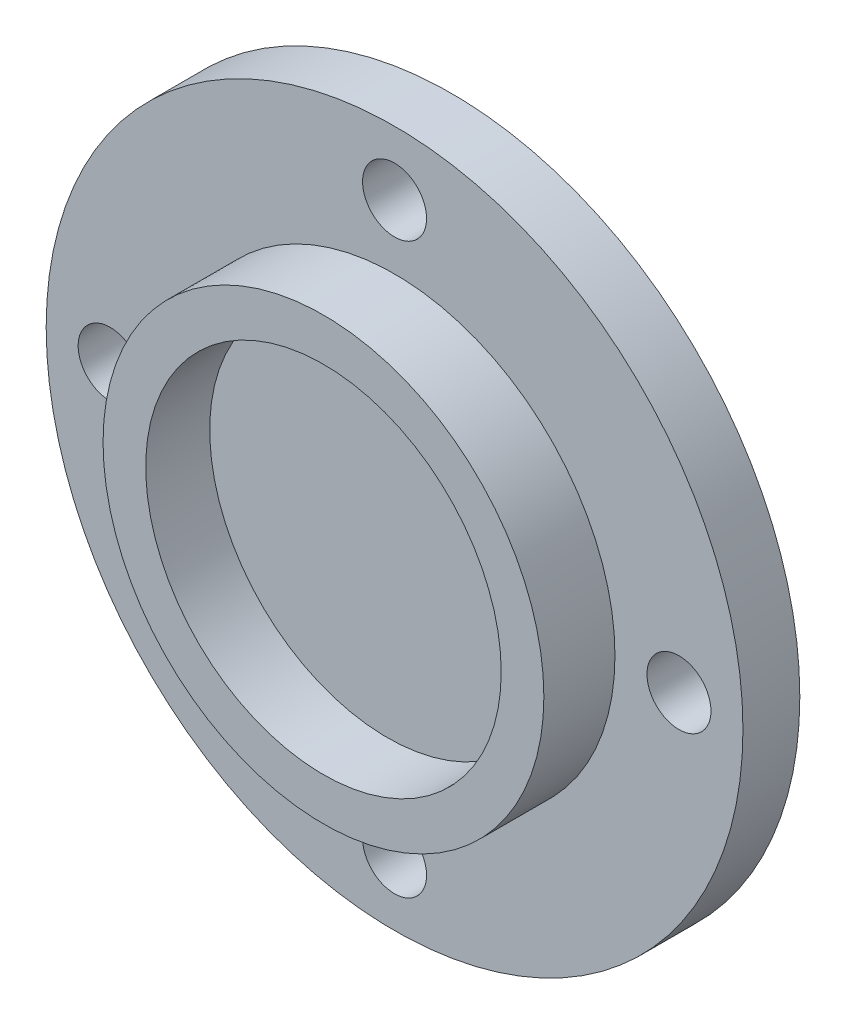
ISO-10303-21;
HEADER;
FILE_DESCRIPTION(('STEP AP214'),'2;1');
FILE_NAME('part.step','',(''),(''),'','','');
FILE_SCHEMA(('AUTOMOTIVE_DESIGN { 1 0 10303 214 1 1 1 1 }'));
ENDSEC;
DATA;
#1=APPLICATION_CONTEXT('core data for automotive mechanical design processes');
#2=APPLICATION_PROTOCOL_DEFINITION('international standard','automotive_design',2000,#1);
#3=PRODUCT_CONTEXT('',#1,'mechanical');
#4=PRODUCT('Part','Part','',(#3));
#5=PRODUCT_RELATED_PRODUCT_CATEGORY('part','',(#4));
#6=PRODUCT_DEFINITION_FORMATION('','',#4);
#7=PRODUCT_DEFINITION_CONTEXT('part definition',#1,'design');
#8=PRODUCT_DEFINITION('design','',#6,#7);
#9=PRODUCT_DEFINITION_SHAPE('','',#8);
#10=(LENGTH_UNIT() NAMED_UNIT(*) SI_UNIT(.MILLI.,.METRE.));
#11=(NAMED_UNIT(*) PLANE_ANGLE_UNIT() SI_UNIT($,.RADIAN.));
#12=(NAMED_UNIT(*) SI_UNIT($,.STERADIAN.) SOLID_ANGLE_UNIT());
#13=UNCERTAINTY_MEASURE_WITH_UNIT(LENGTH_MEASURE(1.E-05),#10,'distance_accuracy_value','');
#14=(GEOMETRIC_REPRESENTATION_CONTEXT(3) GLOBAL_UNCERTAINTY_ASSIGNED_CONTEXT((#13)) GLOBAL_UNIT_ASSIGNED_CONTEXT((#10,
#11,#12)) REPRESENTATION_CONTEXT('',''));
#15=CARTESIAN_POINT('',(0.,0.,0.));
#16=DIRECTION('',(0.,0.,1.));
#17=DIRECTION('',(1.,0.,0.));
#18=AXIS2_PLACEMENT_3D('',#15,#16,#17);
#19=CARTESIAN_POINT('',(0.,0.,8.));
#20=DIRECTION('',(0.,0.,1.));
#21=DIRECTION('',(1.,0.,0.));
#22=AXIS2_PLACEMENT_3D('',#19,#20,#21);
#23=PLANE('',#22);
#24=CARTESIAN_POINT('',(-40.,0.,8.));
#25=DIRECTION('',(0.,0.,1.));
#26=DIRECTION('',(1.,0.,0.));
#27=AXIS2_PLACEMENT_3D('',#24,#25,#26);
#28=CIRCLE('',#27,4.5);
#29=CARTESIAN_POINT('',(-35.5,0.,8.));
#30=VERTEX_POINT('',#29);
#31=EDGE_CURVE('E71',#30,#30,#28,.T.);
#32=ORIENTED_EDGE('',*,*,#31,.F.);
#33=EDGE_LOOP('',(#32));
#34=FACE_BOUND('',#33,.T.);
#35=CARTESIAN_POINT('',(0.,-40.,8.));
#36=DIRECTION('',(0.,0.,1.));
#37=DIRECTION('',(1.,0.,0.));
#38=AXIS2_PLACEMENT_3D('',#35,#36,#37);
#39=CIRCLE('',#38,4.5);
#40=CARTESIAN_POINT('',(4.5,-40.,8.));
#41=VERTEX_POINT('',#40);
#42=EDGE_CURVE('E61',#41,#41,#39,.T.);
#43=ORIENTED_EDGE('',*,*,#42,.F.);
#44=EDGE_LOOP('',(#43));
#45=FACE_BOUND('',#44,.T.);
#46=CARTESIAN_POINT('',(40.,0.,8.));
#47=DIRECTION('',(0.,0.,1.));
#48=DIRECTION('',(1.,0.,0.));
#49=AXIS2_PLACEMENT_3D('',#46,#47,#48);
#50=CIRCLE('',#49,4.5);
#51=CARTESIAN_POINT('',(44.5,0.,8.));
#52=VERTEX_POINT('',#51);
#53=EDGE_CURVE('E58',#52,#52,#50,.T.);
#54=ORIENTED_EDGE('',*,*,#53,.F.);
#55=EDGE_LOOP('',(#54));
#56=FACE_BOUND('',#55,.T.);
#57=CARTESIAN_POINT('',(0.,40.,8.));
#58=DIRECTION('',(0.,0.,1.));
#59=DIRECTION('',(1.,0.,0.));
#60=AXIS2_PLACEMENT_3D('',#57,#58,#59);
#61=CIRCLE('',#60,4.5);
#62=CARTESIAN_POINT('',(4.5,40.,8.));
#63=VERTEX_POINT('',#62);
#64=EDGE_CURVE('E55',#63,#63,#61,.T.);
#65=ORIENTED_EDGE('',*,*,#64,.F.);
#66=EDGE_LOOP('',(#65));
#67=FACE_BOUND('',#66,.T.);
#68=CARTESIAN_POINT('',(0.,0.,8.));
#69=DIRECTION('',(0.,0.,1.));
#70=DIRECTION('',(1.,0.,0.));
#71=AXIS2_PLACEMENT_3D('',#68,#69,#70);
#72=CIRCLE('',#71,49.);
#73=CARTESIAN_POINT('',(49.,0.,8.));
#74=VERTEX_POINT('',#73);
#75=EDGE_CURVE('E10',#74,#74,#72,.T.);
#76=ORIENTED_EDGE('',*,*,#75,.T.);
#77=EDGE_LOOP('',(#76));
#78=FACE_BOUND('',#77,.T.);
#79=CARTESIAN_POINT('',(0.,0.,8.));
#80=DIRECTION('',(0.,0.,1.));
#81=DIRECTION('',(1.,0.,0.));
#82=AXIS2_PLACEMENT_3D('',#79,#80,#81);
#83=CIRCLE('',#82,31.);
#84=CARTESIAN_POINT('',(31.,0.,8.));
#85=VERTEX_POINT('',#84);
#86=EDGE_CURVE('E48',#85,#85,#83,.T.);
#87=ORIENTED_EDGE('',*,*,#86,.F.);
#88=EDGE_LOOP('',(#87));
#89=FACE_BOUND('',#88,.T.);
#90=ADVANCED_FACE('F32',(#34,#45,#56,#67,#78,#89),#23,.T.);
#91=CARTESIAN_POINT('',(0.,0.,8.));
#92=DIRECTION('',(0.,0.,-1.));
#93=DIRECTION('',(-1.,0.,0.));
#94=AXIS2_PLACEMENT_3D('',#91,#92,#93);
#95=CYLINDRICAL_SURFACE('',#94,49.);
#96=ORIENTED_EDGE('',*,*,#75,.F.);
#97=EDGE_LOOP('',(#96));
#98=FACE_BOUND('',#97,.T.);
#99=CARTESIAN_POINT('',(0.,0.,0.));
#100=DIRECTION('',(0.,0.,1.));
#101=DIRECTION('',(1.,0.,0.));
#102=AXIS2_PLACEMENT_3D('',#99,#100,#101);
#103=CIRCLE('',#102,49.);
#104=CARTESIAN_POINT('',(49.,0.,0.));
#105=VERTEX_POINT('',#104);
#106=EDGE_CURVE('E40',#105,#105,#103,.T.);
#107=ORIENTED_EDGE('',*,*,#106,.T.);
#108=EDGE_LOOP('',(#107));
#109=FACE_BOUND('',#108,.T.);
#110=ADVANCED_FACE('F34',(#98,#109),#95,.T.);
#111=CARTESIAN_POINT('',(0.,0.,0.));
#112=DIRECTION('',(0.,0.,1.));
#113=DIRECTION('',(1.,0.,0.));
#114=AXIS2_PLACEMENT_3D('',#111,#112,#113);
#115=PLANE('',#114);
#116=CARTESIAN_POINT('',(-40.,0.,0.));
#117=DIRECTION('',(0.,0.,1.));
#118=DIRECTION('',(1.,0.,0.));
#119=AXIS2_PLACEMENT_3D('',#116,#117,#118);
#120=CIRCLE('',#119,4.5);
#121=CARTESIAN_POINT('',(-35.5,0.,0.));
#122=VERTEX_POINT('',#121);
#123=EDGE_CURVE('E36',#122,#122,#120,.T.);
#124=ORIENTED_EDGE('',*,*,#123,.T.);
#125=EDGE_LOOP('',(#124));
#126=FACE_BOUND('',#125,.T.);
#127=CARTESIAN_POINT('',(0.,-40.,0.));
#128=DIRECTION('',(0.,0.,1.));
#129=DIRECTION('',(1.,0.,0.));
#130=AXIS2_PLACEMENT_3D('',#127,#128,#129);
#131=CIRCLE('',#130,4.5);
#132=CARTESIAN_POINT('',(4.5,-40.,0.));
#133=VERTEX_POINT('',#132);
#134=EDGE_CURVE('E59',#133,#133,#131,.T.);
#135=ORIENTED_EDGE('',*,*,#134,.T.);
#136=EDGE_LOOP('',(#135));
#137=FACE_BOUND('',#136,.T.);
#138=CARTESIAN_POINT('',(40.,0.,0.));
#139=DIRECTION('',(0.,0.,1.));
#140=DIRECTION('',(1.,0.,0.));
#141=AXIS2_PLACEMENT_3D('',#138,#139,#140);
#142=CIRCLE('',#141,4.5);
#143=CARTESIAN_POINT('',(44.5,0.,0.));
#144=VERTEX_POINT('',#143);
#145=EDGE_CURVE('E56',#144,#144,#142,.T.);
#146=ORIENTED_EDGE('',*,*,#145,.T.);
#147=EDGE_LOOP('',(#146));
#148=FACE_BOUND('',#147,.T.);
#149=CARTESIAN_POINT('',(0.,40.,0.));
#150=DIRECTION('',(0.,0.,1.));
#151=DIRECTION('',(1.,0.,0.));
#152=AXIS2_PLACEMENT_3D('',#149,#150,#151);
#153=CIRCLE('',#152,4.5);
#154=CARTESIAN_POINT('',(4.5,40.,0.));
#155=VERTEX_POINT('',#154);
#156=EDGE_CURVE('E51',#155,#155,#153,.T.);
#157=ORIENTED_EDGE('',*,*,#156,.T.);
#158=EDGE_LOOP('',(#157));
#159=FACE_BOUND('',#158,.T.);
#160=ORIENTED_EDGE('',*,*,#106,.F.);
#161=EDGE_LOOP('',(#160));
#162=FACE_BOUND('',#161,.T.);
#163=ADVANCED_FACE('F94',(#126,#137,#148,#159,#162),#115,.F.);
#164=CARTESIAN_POINT('',(0.,0.,18.));
#165=DIRECTION('',(0.,0.,-1.));
#166=DIRECTION('',(-1.,0.,0.));
#167=AXIS2_PLACEMENT_3D('',#164,#165,#166);
#168=CYLINDRICAL_SURFACE('',#167,31.);
#169=CARTESIAN_POINT('',(0.,0.,18.));
#170=DIRECTION('',(0.,0.,1.));
#171=DIRECTION('',(1.,0.,0.));
#172=AXIS2_PLACEMENT_3D('',#169,#170,#171);
#173=CIRCLE('',#172,31.);
#174=CARTESIAN_POINT('',(31.,0.,18.));
#175=VERTEX_POINT('',#174);
#176=EDGE_CURVE('E45',#175,#175,#173,.T.);
#177=ORIENTED_EDGE('',*,*,#176,.F.);
#178=EDGE_LOOP('',(#177));
#179=FACE_BOUND('',#178,.T.);
#180=ORIENTED_EDGE('',*,*,#86,.T.);
#181=EDGE_LOOP('',(#180));
#182=FACE_BOUND('',#181,.T.);
#183=ADVANCED_FACE('F86',(#179,#182),#168,.T.);
#184=CARTESIAN_POINT('',(0.,0.,18.));
#185=DIRECTION('',(0.,0.,1.));
#186=DIRECTION('',(1.,0.,0.));
#187=AXIS2_PLACEMENT_3D('',#184,#185,#186);
#188=PLANE('',#187);
#189=CARTESIAN_POINT('',(0.,0.,18.));
#190=DIRECTION('',(0.,0.,1.));
#191=DIRECTION('',(1.,0.,0.));
#192=AXIS2_PLACEMENT_3D('',#189,#190,#191);
#193=CIRCLE('',#192,25.);
#194=CARTESIAN_POINT('',(25.,0.,18.));
#195=VERTEX_POINT('',#194);
#196=EDGE_CURVE('E54',#195,#195,#193,.T.);
#197=ORIENTED_EDGE('',*,*,#196,.F.);
#198=EDGE_LOOP('',(#197));
#199=FACE_BOUND('',#198,.T.);
#200=ORIENTED_EDGE('',*,*,#176,.T.);
#201=EDGE_LOOP('',(#200));
#202=FACE_BOUND('',#201,.T.);
#203=ADVANCED_FACE('F105',(#199,#202),#188,.T.);
#204=CARTESIAN_POINT('',(0.,0.,9.));
#205=DIRECTION('',(0.,0.,1.));
#206=DIRECTION('',(1.,0.,0.));
#207=AXIS2_PLACEMENT_3D('',#204,#205,#206);
#208=CYLINDRICAL_SURFACE('',#207,25.);
#209=CARTESIAN_POINT('',(0.,0.,9.));
#210=DIRECTION('',(0.,0.,1.));
#211=DIRECTION('',(1.,0.,0.));
#212=AXIS2_PLACEMENT_3D('',#209,#210,#211);
#213=CIRCLE('',#212,25.);
#214=CARTESIAN_POINT('',(25.,0.,9.));
#215=VERTEX_POINT('',#214);
#216=EDGE_CURVE('E76',#215,#215,#213,.T.);
#217=ORIENTED_EDGE('',*,*,#216,.F.);
#218=EDGE_LOOP('',(#217));
#219=FACE_BOUND('',#218,.T.);
#220=ORIENTED_EDGE('',*,*,#196,.T.);
#221=EDGE_LOOP('',(#220));
#222=FACE_BOUND('',#221,.T.);
#223=ADVANCED_FACE('F129',(#219,#222),#208,.F.);
#224=CARTESIAN_POINT('',(0.,0.,9.));
#225=DIRECTION('',(0.,0.,1.));
#226=DIRECTION('',(1.,0.,0.));
#227=AXIS2_PLACEMENT_3D('',#224,#225,#226);
#228=PLANE('',#227);
#229=ORIENTED_EDGE('',*,*,#216,.T.);
#230=EDGE_LOOP('',(#229));
#231=FACE_BOUND('',#230,.T.);
#232=ADVANCED_FACE('F119',(#231),#228,.T.);
#233=CARTESIAN_POINT('',(0.,40.,-41.));
#234=DIRECTION('',(0.,0.,1.));
#235=DIRECTION('',(1.,0.,0.));
#236=AXIS2_PLACEMENT_3D('',#233,#234,#235);
#237=CYLINDRICAL_SURFACE('',#236,4.5);
#238=ORIENTED_EDGE('',*,*,#64,.T.);
#239=EDGE_LOOP('',(#238));
#240=FACE_BOUND('',#239,.T.);
#241=ORIENTED_EDGE('',*,*,#156,.F.);
#242=EDGE_LOOP('',(#241));
#243=FACE_BOUND('',#242,.T.);
#244=ADVANCED_FACE('F116',(#240,#243),#237,.F.);
#245=CARTESIAN_POINT('',(40.,0.,-41.));
#246=DIRECTION('',(0.,0.,1.));
#247=DIRECTION('',(1.,0.,0.));
#248=AXIS2_PLACEMENT_3D('',#245,#246,#247);
#249=CYLINDRICAL_SURFACE('',#248,4.5);
#250=ORIENTED_EDGE('',*,*,#53,.T.);
#251=EDGE_LOOP('',(#250));
#252=FACE_BOUND('',#251,.T.);
#253=ORIENTED_EDGE('',*,*,#145,.F.);
#254=EDGE_LOOP('',(#253));
#255=FACE_BOUND('',#254,.T.);
#256=ADVANCED_FACE('F118',(#252,#255),#249,.F.);
#257=CARTESIAN_POINT('',(0.,-40.,-41.));
#258=DIRECTION('',(0.,0.,1.));
#259=DIRECTION('',(1.,0.,0.));
#260=AXIS2_PLACEMENT_3D('',#257,#258,#259);
#261=CYLINDRICAL_SURFACE('',#260,4.5);
#262=ORIENTED_EDGE('',*,*,#42,.T.);
#263=EDGE_LOOP('',(#262));
#264=FACE_BOUND('',#263,.T.);
#265=ORIENTED_EDGE('',*,*,#134,.F.);
#266=EDGE_LOOP('',(#265));
#267=FACE_BOUND('',#266,.T.);
#268=ADVANCED_FACE('F126',(#264,#267),#261,.F.);
#269=CARTESIAN_POINT('',(-40.,0.,-41.));
#270=DIRECTION('',(0.,0.,1.));
#271=DIRECTION('',(1.,0.,0.));
#272=AXIS2_PLACEMENT_3D('',#269,#270,#271);
#273=CYLINDRICAL_SURFACE('',#272,4.5);
#274=ORIENTED_EDGE('',*,*,#31,.T.);
#275=EDGE_LOOP('',(#274));
#276=FACE_BOUND('',#275,.T.);
#277=ORIENTED_EDGE('',*,*,#123,.F.);
#278=EDGE_LOOP('',(#277));
#279=FACE_BOUND('',#278,.T.);
#280=ADVANCED_FACE('F181',(#276,#279),#273,.F.);
#281=CLOSED_SHELL('',(#90,#110,#163,#183,#203,#223,#232,#244,#256,#268,#280));
#282=MANIFOLD_SOLID_BREP('B2',#281);
#283=ADVANCED_BREP_SHAPE_REPRESENTATION('',(#18,#282),#14);
#284=SHAPE_DEFINITION_REPRESENTATION(#9,#283);
ENDSEC;
END-ISO-10303-21;
